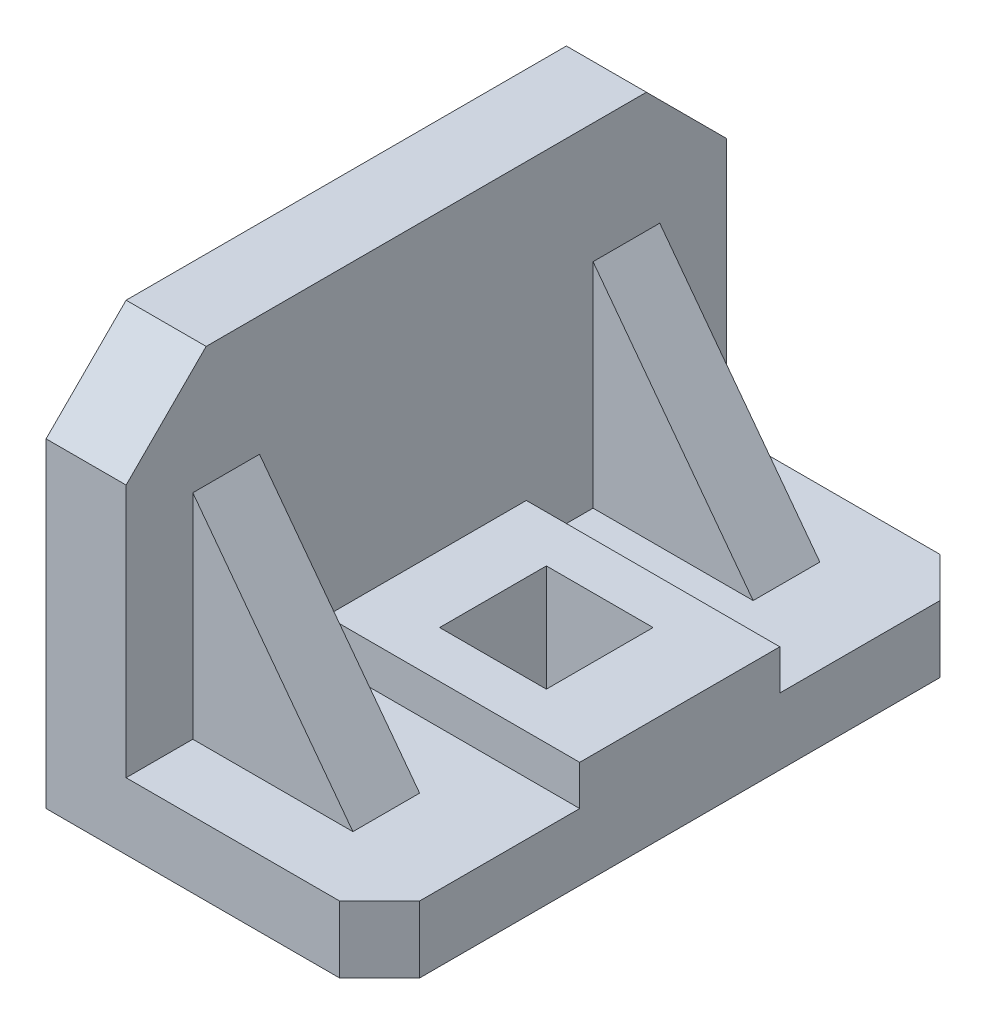
ISO-10303-21;
HEADER;
FILE_DESCRIPTION(('STEP AP214'),'2;1');
FILE_NAME('part.step','',(''),(''),'','','');
FILE_SCHEMA(('AUTOMOTIVE_DESIGN { 1 0 10303 214 1 1 1 1 }'));
ENDSEC;
DATA;
#1=APPLICATION_CONTEXT('core data for automotive mechanical design processes');
#2=APPLICATION_PROTOCOL_DEFINITION('international standard','automotive_design',2000,#1);
#3=PRODUCT_CONTEXT('',#1,'mechanical');
#4=PRODUCT('Part','Part','',(#3));
#5=PRODUCT_RELATED_PRODUCT_CATEGORY('part','',(#4));
#6=PRODUCT_DEFINITION_FORMATION('','',#4);
#7=PRODUCT_DEFINITION_CONTEXT('part definition',#1,'design');
#8=PRODUCT_DEFINITION('design','',#6,#7);
#9=PRODUCT_DEFINITION_SHAPE('','',#8);
#10=(LENGTH_UNIT() NAMED_UNIT(*) SI_UNIT(.MILLI.,.METRE.));
#11=(NAMED_UNIT(*) PLANE_ANGLE_UNIT() SI_UNIT($,.RADIAN.));
#12=(NAMED_UNIT(*) SI_UNIT($,.STERADIAN.) SOLID_ANGLE_UNIT());
#13=UNCERTAINTY_MEASURE_WITH_UNIT(LENGTH_MEASURE(1.E-05),#10,'distance_accuracy_value','');
#14=(GEOMETRIC_REPRESENTATION_CONTEXT(3) GLOBAL_UNCERTAINTY_ASSIGNED_CONTEXT((#13)) GLOBAL_UNIT_ASSIGNED_CONTEXT((#10,
#11,#12)) REPRESENTATION_CONTEXT('',''));
#15=CARTESIAN_POINT('',(0.,0.,0.));
#16=DIRECTION('',(0.,0.,1.));
#17=DIRECTION('',(1.,0.,0.));
#18=AXIS2_PLACEMENT_3D('',#15,#16,#17);
#19=CARTESIAN_POINT('',(304.8,1524.,2286.));
#20=DIRECTION('',(-1.,0.,0.));
#21=DIRECTION('',(0.,-1.,0.));
#22=AXIS2_PLACEMENT_3D('',#19,#20,#21);
#23=PLANE('',#22);
#24=DIRECTION('',(0.,-1.,0.));
#25=VECTOR('',#24,1.);
#26=CARTESIAN_POINT('',(304.8,1066.8,508.));
#27=LINE('',#26,#25);
#28=CARTESIAN_POINT('',(304.8,1066.8,508.));
#29=VERTEX_POINT('',#28);
#30=CARTESIAN_POINT('',(304.8,254.,508.));
#31=VERTEX_POINT('',#30);
#32=EDGE_CURVE('E219',#29,#31,#27,.T.);
#33=ORIENTED_EDGE('',*,*,#32,.F.);
#34=DIRECTION('',(0.,0.,1.));
#35=VECTOR('',#34,1.);
#36=CARTESIAN_POINT('',(304.8,1066.8,508.));
#37=LINE('',#36,#35);
#38=CARTESIAN_POINT('',(304.8,1066.8,254.));
#39=VERTEX_POINT('',#38);
#40=EDGE_CURVE('E205',#39,#29,#37,.T.);
#41=ORIENTED_EDGE('',*,*,#40,.F.);
#42=DIRECTION('',(0.,1.,0.));
#43=VECTOR('',#42,1.);
#44=CARTESIAN_POINT('',(304.8,1066.8,254.));
#45=LINE('',#44,#43);
#46=CARTESIAN_POINT('',(304.8,254.,254.));
#47=VERTEX_POINT('',#46);
#48=EDGE_CURVE('E214',#47,#39,#45,.T.);
#49=ORIENTED_EDGE('',*,*,#48,.F.);
#50=DIRECTION('',(0.,0.,-1.));
#51=VECTOR('',#50,1.);
#52=CARTESIAN_POINT('',(304.8,254.,762.));
#53=LINE('',#52,#51);
#54=CARTESIAN_POINT('',(304.8,254.,0.));
#55=VERTEX_POINT('',#54);
#56=EDGE_CURVE('E390',#47,#55,#53,.T.);
#57=ORIENTED_EDGE('',*,*,#56,.T.);
#58=DIRECTION('',(0.,1.,0.));
#59=VECTOR('',#58,1.);
#60=CARTESIAN_POINT('',(304.8,1524.,0.));
#61=LINE('',#60,#59);
#62=CARTESIAN_POINT('',(304.8,1219.2,0.));
#63=VERTEX_POINT('',#62);
#64=EDGE_CURVE('E413',#55,#63,#61,.T.);
#65=ORIENTED_EDGE('',*,*,#64,.T.);
#66=DIRECTION('',(0.,-0.707106781186547,-0.707106781186548));
#67=VECTOR('',#66,1.);
#68=CARTESIAN_POINT('',(304.8,1524.,304.8));
#69=LINE('',#68,#67);
#70=CARTESIAN_POINT('',(304.8,1524.,304.8));
#71=VERTEX_POINT('',#70);
#72=EDGE_CURVE('E338',#71,#63,#69,.T.);
#73=ORIENTED_EDGE('',*,*,#72,.F.);
#74=DIRECTION('',(0.,0.,-1.));
#75=VECTOR('',#74,1.);
#76=CARTESIAN_POINT('',(304.8,1524.,2286.));
#77=LINE('',#76,#75);
#78=CARTESIAN_POINT('',(304.8,1524.,1981.2));
#79=VERTEX_POINT('',#78);
#80=EDGE_CURVE('E434',#79,#71,#77,.T.);
#81=ORIENTED_EDGE('',*,*,#80,.F.);
#82=DIRECTION('',(0.,-0.707106781186548,0.707106781186548));
#83=VECTOR('',#82,1.);
#84=CARTESIAN_POINT('',(304.8,1524.,1981.2));
#85=LINE('',#84,#83);
#86=CARTESIAN_POINT('',(304.8,1219.2,2286.));
#87=VERTEX_POINT('',#86);
#88=EDGE_CURVE('E334',#79,#87,#85,.T.);
#89=ORIENTED_EDGE('',*,*,#88,.T.);
#90=DIRECTION('',(0.,1.,0.));
#91=VECTOR('',#90,1.);
#92=CARTESIAN_POINT('',(304.8,1524.,2286.));
#93=LINE('',#92,#91);
#94=CARTESIAN_POINT('',(304.8,254.,2286.));
#95=VERTEX_POINT('',#94);
#96=EDGE_CURVE('E417',#95,#87,#93,.T.);
#97=ORIENTED_EDGE('',*,*,#96,.F.);
#98=DIRECTION('',(0.,0.,-1.));
#99=VECTOR('',#98,1.);
#100=CARTESIAN_POINT('',(304.8,254.,2286.));
#101=LINE('',#100,#99);
#102=CARTESIAN_POINT('',(304.8,254.,2032.));
#103=VERTEX_POINT('',#102);
#104=EDGE_CURVE('E358',#95,#103,#101,.T.);
#105=ORIENTED_EDGE('',*,*,#104,.T.);
#106=DIRECTION('',(0.,-1.,0.));
#107=VECTOR('',#106,1.);
#108=CARTESIAN_POINT('',(304.8,1066.8,2032.));
#109=LINE('',#108,#107);
#110=CARTESIAN_POINT('',(304.8,1066.8,2032.));
#111=VERTEX_POINT('',#110);
#112=EDGE_CURVE('E230',#111,#103,#109,.T.);
#113=ORIENTED_EDGE('',*,*,#112,.F.);
#114=DIRECTION('',(0.,0.,1.));
#115=VECTOR('',#114,1.);
#116=CARTESIAN_POINT('',(304.8,1066.8,2032.));
#117=LINE('',#116,#115);
#118=CARTESIAN_POINT('',(304.8,1066.8,1778.));
#119=VERTEX_POINT('',#118);
#120=EDGE_CURVE('E244',#119,#111,#117,.T.);
#121=ORIENTED_EDGE('',*,*,#120,.F.);
#122=DIRECTION('',(0.,1.,0.));
#123=VECTOR('',#122,1.);
#124=CARTESIAN_POINT('',(304.8,1066.8,1778.));
#125=LINE('',#124,#123);
#126=CARTESIAN_POINT('',(304.8,254.,1778.));
#127=VERTEX_POINT('',#126);
#128=EDGE_CURVE('E234',#127,#119,#125,.T.);
#129=ORIENTED_EDGE('',*,*,#128,.F.);
#130=CARTESIAN_POINT('',(304.8,254.,1524.));
#131=VERTEX_POINT('',#130);
#132=EDGE_CURVE('E363',#127,#131,#101,.T.);
#133=ORIENTED_EDGE('',*,*,#132,.T.);
#134=DIRECTION('',(0.,1.,0.));
#135=VECTOR('',#134,1.);
#136=CARTESIAN_POINT('',(304.8,406.4,1524.));
#137=LINE('',#136,#135);
#138=CARTESIAN_POINT('',(304.8,406.4,1524.));
#139=VERTEX_POINT('',#138);
#140=EDGE_CURVE('E362',#131,#139,#137,.T.);
#141=ORIENTED_EDGE('',*,*,#140,.T.);
#142=DIRECTION('',(0.,0.,-1.));
#143=VECTOR('',#142,1.);
#144=CARTESIAN_POINT('',(304.8,406.4,2286.));
#145=LINE('',#144,#143);
#146=CARTESIAN_POINT('',(304.8,406.4,762.));
#147=VERTEX_POINT('',#146);
#148=EDGE_CURVE('E438',#139,#147,#145,.T.);
#149=ORIENTED_EDGE('',*,*,#148,.T.);
#150=DIRECTION('',(0.,-1.,0.));
#151=VECTOR('',#150,1.);
#152=CARTESIAN_POINT('',(304.8,406.4,762.));
#153=LINE('',#152,#151);
#154=CARTESIAN_POINT('',(304.8,254.,762.));
#155=VERTEX_POINT('',#154);
#156=EDGE_CURVE('E401',#147,#155,#153,.T.);
#157=ORIENTED_EDGE('',*,*,#156,.T.);
#158=EDGE_CURVE('E228',#155,#31,#53,.T.);
#159=ORIENTED_EDGE('',*,*,#158,.T.);
#160=EDGE_LOOP('',(#33,#41,#49,#57,#65,#73,#81,#89,#97,#105,#113,#121,#129,#133,#141,#149,#157,#159));
#161=FACE_BOUND('',#160,.T.);
#162=ADVANCED_FACE('F45',(#161),#23,.F.);
#163=CARTESIAN_POINT('',(304.8,254.,762.));
#164=DIRECTION('',(0.,-1.,0.));
#165=DIRECTION('',(0.,0.,-1.));
#166=AXIS2_PLACEMENT_3D('',#163,#164,#165);
#167=PLANE('',#166);
#168=DIRECTION('',(-1.,0.,0.));
#169=VECTOR('',#168,1.);
#170=CARTESIAN_POINT('',(914.4,254.,508.));
#171=LINE('',#170,#169);
#172=CARTESIAN_POINT('',(914.4,254.,508.));
#173=VERTEX_POINT('',#172);
#174=EDGE_CURVE('E221',#173,#31,#171,.T.);
#175=ORIENTED_EDGE('',*,*,#174,.T.);
#176=ORIENTED_EDGE('',*,*,#158,.F.);
#177=DIRECTION('',(1.,0.,0.));
#178=VECTOR('',#177,1.);
#179=CARTESIAN_POINT('',(304.8,254.,762.));
#180=LINE('',#179,#178);
#181=CARTESIAN_POINT('',(1270.,254.,762.));
#182=VERTEX_POINT('',#181);
#183=EDGE_CURVE('E387',#155,#182,#180,.T.);
#184=ORIENTED_EDGE('',*,*,#183,.T.);
#185=DIRECTION('',(0.,0.,-1.));
#186=VECTOR('',#185,1.);
#187=CARTESIAN_POINT('',(1270.,254.,762.));
#188=LINE('',#187,#186);
#189=CARTESIAN_POINT('',(1270.,254.,152.4));
#190=VERTEX_POINT('',#189);
#191=EDGE_CURVE('E397',#182,#190,#188,.T.);
#192=ORIENTED_EDGE('',*,*,#191,.T.);
#193=DIRECTION('',(0.707106781186548,0.,0.707106781186547));
#194=VECTOR('',#193,1.);
#195=CARTESIAN_POINT('',(1117.6,254.,0.));
#196=LINE('',#195,#194);
#197=CARTESIAN_POINT('',(1117.6,254.,0.));
#198=VERTEX_POINT('',#197);
#199=EDGE_CURVE('E302',#198,#190,#196,.T.);
#200=ORIENTED_EDGE('',*,*,#199,.F.);
#201=DIRECTION('',(1.,0.,0.));
#202=VECTOR('',#201,1.);
#203=CARTESIAN_POINT('',(304.8,254.,0.));
#204=LINE('',#203,#202);
#205=EDGE_CURVE('E391',#55,#198,#204,.T.);
#206=ORIENTED_EDGE('',*,*,#205,.F.);
#207=ORIENTED_EDGE('',*,*,#56,.F.);
#208=DIRECTION('',(-1.,0.,0.));
#209=VECTOR('',#208,1.);
#210=CARTESIAN_POINT('',(914.4,254.,254.));
#211=LINE('',#210,#209);
#212=CARTESIAN_POINT('',(914.4,254.,254.));
#213=VERTEX_POINT('',#212);
#214=EDGE_CURVE('E240',#213,#47,#211,.T.);
#215=ORIENTED_EDGE('',*,*,#214,.F.);
#216=DIRECTION('',(0.,0.,-1.));
#217=VECTOR('',#216,1.);
#218=CARTESIAN_POINT('',(914.4,254.,508.));
#219=LINE('',#218,#217);
#220=EDGE_CURVE('E215',#173,#213,#219,.T.);
#221=ORIENTED_EDGE('',*,*,#220,.F.);
#222=EDGE_LOOP('',(#175,#176,#184,#192,#200,#206,#207,#215,#221));
#223=FACE_BOUND('',#222,.T.);
#224=ADVANCED_FACE('F468',(#223),#167,.F.);
#225=CARTESIAN_POINT('',(304.8,254.,2286.));
#226=DIRECTION('',(0.,-1.,0.));
#227=DIRECTION('',(0.,0.,-1.));
#228=AXIS2_PLACEMENT_3D('',#225,#226,#227);
#229=PLANE('',#228);
#230=DIRECTION('',(-1.,0.,0.));
#231=VECTOR('',#230,1.);
#232=CARTESIAN_POINT('',(914.4,254.,2032.));
#233=LINE('',#232,#231);
#234=CARTESIAN_POINT('',(914.4,254.,2032.));
#235=VERTEX_POINT('',#234);
#236=EDGE_CURVE('E253',#235,#103,#233,.T.);
#237=ORIENTED_EDGE('',*,*,#236,.T.);
#238=ORIENTED_EDGE('',*,*,#104,.F.);
#239=DIRECTION('',(1.,0.,0.));
#240=VECTOR('',#239,1.);
#241=CARTESIAN_POINT('',(304.8,254.,2286.));
#242=LINE('',#241,#240);
#243=CARTESIAN_POINT('',(1117.6,254.,2286.));
#244=VERTEX_POINT('',#243);
#245=EDGE_CURVE('E367',#95,#244,#242,.T.);
#246=ORIENTED_EDGE('',*,*,#245,.T.);
#247=DIRECTION('',(-0.707106781186547,0.,0.707106781186547));
#248=VECTOR('',#247,1.);
#249=CARTESIAN_POINT('',(1270.,254.,2133.6));
#250=LINE('',#249,#248);
#251=CARTESIAN_POINT('',(1270.,254.,2133.6));
#252=VERTEX_POINT('',#251);
#253=EDGE_CURVE('E306',#252,#244,#250,.T.);
#254=ORIENTED_EDGE('',*,*,#253,.F.);
#255=DIRECTION('',(0.,0.,-1.));
#256=VECTOR('',#255,1.);
#257=CARTESIAN_POINT('',(1270.,254.,2286.));
#258=LINE('',#257,#256);
#259=CARTESIAN_POINT('',(1270.,254.,1524.));
#260=VERTEX_POINT('',#259);
#261=EDGE_CURVE('E368',#252,#260,#258,.T.);
#262=ORIENTED_EDGE('',*,*,#261,.T.);
#263=DIRECTION('',(1.,0.,0.));
#264=VECTOR('',#263,1.);
#265=CARTESIAN_POINT('',(304.8,254.,1524.));
#266=LINE('',#265,#264);
#267=EDGE_CURVE('E380',#131,#260,#266,.T.);
#268=ORIENTED_EDGE('',*,*,#267,.F.);
#269=ORIENTED_EDGE('',*,*,#132,.F.);
#270=DIRECTION('',(-1.,0.,0.));
#271=VECTOR('',#270,1.);
#272=CARTESIAN_POINT('',(914.4,254.,1778.));
#273=LINE('',#272,#271);
#274=CARTESIAN_POINT('',(914.4,254.,1778.));
#275=VERTEX_POINT('',#274);
#276=EDGE_CURVE('E243',#275,#127,#273,.T.);
#277=ORIENTED_EDGE('',*,*,#276,.F.);
#278=DIRECTION('',(0.,0.,-1.));
#279=VECTOR('',#278,1.);
#280=CARTESIAN_POINT('',(914.4,254.,2032.));
#281=LINE('',#280,#279);
#282=EDGE_CURVE('E241',#235,#275,#281,.T.);
#283=ORIENTED_EDGE('',*,*,#282,.F.);
#284=EDGE_LOOP('',(#237,#238,#246,#254,#262,#268,#269,#277,#283));
#285=FACE_BOUND('',#284,.T.);
#286=ADVANCED_FACE('F488',(#285),#229,.F.);
#287=CARTESIAN_POINT('',(0.,1524.,2286.));
#288=DIRECTION('',(1.,0.,0.));
#289=DIRECTION('',(0.,0.,-1.));
#290=AXIS2_PLACEMENT_3D('',#287,#288,#289);
#291=PLANE('',#290);
#292=DIRECTION('',(0.,-0.707106781186548,0.707106781186548));
#293=VECTOR('',#292,1.);
#294=CARTESIAN_POINT('',(0.,1524.,1981.2));
#295=LINE('',#294,#293);
#296=CARTESIAN_POINT('',(0.,1524.,1981.2));
#297=VERTEX_POINT('',#296);
#298=CARTESIAN_POINT('',(0.,1219.2,2286.));
#299=VERTEX_POINT('',#298);
#300=EDGE_CURVE('E330',#297,#299,#295,.T.);
#301=ORIENTED_EDGE('',*,*,#300,.F.);
#302=DIRECTION('',(0.,0.,-1.));
#303=VECTOR('',#302,1.);
#304=CARTESIAN_POINT('',(0.,1524.,2286.));
#305=LINE('',#304,#303);
#306=CARTESIAN_POINT('',(0.,1524.,304.8));
#307=VERTEX_POINT('',#306);
#308=EDGE_CURVE('E421',#297,#307,#305,.T.);
#309=ORIENTED_EDGE('',*,*,#308,.T.);
#310=DIRECTION('',(0.,-0.707106781186547,-0.707106781186548));
#311=VECTOR('',#310,1.);
#312=CARTESIAN_POINT('',(0.,1524.,304.8));
#313=LINE('',#312,#311);
#314=CARTESIAN_POINT('',(0.,1219.2,0.));
#315=VERTEX_POINT('',#314);
#316=EDGE_CURVE('E349',#307,#315,#313,.T.);
#317=ORIENTED_EDGE('',*,*,#316,.T.);
#318=DIRECTION('',(0.,-1.,0.));
#319=VECTOR('',#318,1.);
#320=CARTESIAN_POINT('',(0.,1524.,0.));
#321=LINE('',#320,#319);
#322=CARTESIAN_POINT('',(0.,0.,0.));
#323=VERTEX_POINT('',#322);
#324=EDGE_CURVE('E379',#315,#323,#321,.T.);
#325=ORIENTED_EDGE('',*,*,#324,.T.);
#326=DIRECTION('',(0.,0.,-1.));
#327=VECTOR('',#326,1.);
#328=CARTESIAN_POINT('',(0.,0.,2286.));
#329=LINE('',#328,#327);
#330=CARTESIAN_POINT('',(0.,0.,2286.));
#331=VERTEX_POINT('',#330);
#332=EDGE_CURVE('E11',#331,#323,#329,.T.);
#333=ORIENTED_EDGE('',*,*,#332,.F.);
#334=DIRECTION('',(0.,-1.,0.));
#335=VECTOR('',#334,1.);
#336=CARTESIAN_POINT('',(0.,1524.,2286.));
#337=LINE('',#336,#335);
#338=EDGE_CURVE('E409',#299,#331,#337,.T.);
#339=ORIENTED_EDGE('',*,*,#338,.F.);
#340=EDGE_LOOP('',(#301,#309,#317,#325,#333,#339));
#341=FACE_BOUND('',#340,.T.);
#342=ADVANCED_FACE('F47',(#341),#291,.F.);
#343=CARTESIAN_POINT('',(0.,1524.,2286.));
#344=DIRECTION('',(0.,-1.,0.));
#345=DIRECTION('',(0.,0.,-1.));
#346=AXIS2_PLACEMENT_3D('',#343,#344,#345);
#347=PLANE('',#346);
#348=DIRECTION('',(1.,0.,0.));
#349=VECTOR('',#348,1.);
#350=CARTESIAN_POINT('',(0.,1524.,1981.2));
#351=LINE('',#350,#349);
#352=EDGE_CURVE('E341',#297,#79,#351,.T.);
#353=ORIENTED_EDGE('',*,*,#352,.T.);
#354=ORIENTED_EDGE('',*,*,#80,.T.);
#355=DIRECTION('',(1.,0.,0.));
#356=VECTOR('',#355,1.);
#357=CARTESIAN_POINT('',(0.,1524.,304.8));
#358=LINE('',#357,#356);
#359=EDGE_CURVE('E346',#307,#71,#358,.T.);
#360=ORIENTED_EDGE('',*,*,#359,.F.);
#361=ORIENTED_EDGE('',*,*,#308,.F.);
#362=EDGE_LOOP('',(#353,#354,#360,#361));
#363=FACE_BOUND('',#362,.T.);
#364=ADVANCED_FACE('F541',(#363),#347,.F.);
#365=CARTESIAN_POINT('',(0.,0.,2286.));
#366=DIRECTION('',(0.,0.,1.));
#367=DIRECTION('',(1.,0.,0.));
#368=AXIS2_PLACEMENT_3D('',#365,#366,#367);
#369=PLANE('',#368);
#370=DIRECTION('',(0.,1.,0.));
#371=VECTOR('',#370,1.);
#372=CARTESIAN_POINT('',(1117.6,-50.8000000000001,2286.));
#373=LINE('',#372,#371);
#374=CARTESIAN_POINT('',(1117.6,0.,2286.));
#375=VERTEX_POINT('',#374);
#376=EDGE_CURVE('E292',#375,#244,#373,.T.);
#377=ORIENTED_EDGE('',*,*,#376,.T.);
#378=ORIENTED_EDGE('',*,*,#245,.F.);
#379=ORIENTED_EDGE('',*,*,#96,.T.);
#380=DIRECTION('',(1.,0.,0.));
#381=VECTOR('',#380,1.);
#382=CARTESIAN_POINT('',(0.,1219.2,2286.));
#383=LINE('',#382,#381);
#384=EDGE_CURVE('E333',#299,#87,#383,.T.);
#385=ORIENTED_EDGE('',*,*,#384,.F.);
#386=ORIENTED_EDGE('',*,*,#338,.T.);
#387=DIRECTION('',(1.,0.,0.));
#388=VECTOR('',#387,1.);
#389=CARTESIAN_POINT('',(0.,0.,2286.));
#390=LINE('',#389,#388);
#391=EDGE_CURVE('E412',#331,#375,#390,.T.);
#392=ORIENTED_EDGE('',*,*,#391,.T.);
#393=EDGE_LOOP('',(#377,#378,#379,#385,#386,#392));
#394=FACE_BOUND('',#393,.T.);
#395=ADVANCED_FACE('F495',(#394),#369,.T.);
#396=CARTESIAN_POINT('',(0.,0.,2286.));
#397=DIRECTION('',(0.,1.,0.));
#398=DIRECTION('',(0.,0.,1.));
#399=AXIS2_PLACEMENT_3D('',#396,#397,#398);
#400=PLANE('',#399);
#401=DIRECTION('',(-1.,0.,0.));
#402=VECTOR('',#401,1.);
#403=CARTESIAN_POINT('',(558.8,0.,939.8));
#404=LINE('',#403,#402);
#405=CARTESIAN_POINT('',(965.2,0.,939.8));
#406=VERTEX_POINT('',#405);
#407=CARTESIAN_POINT('',(558.8,0.,939.8));
#408=VERTEX_POINT('',#407);
#409=EDGE_CURVE('E271',#406,#408,#404,.T.);
#410=ORIENTED_EDGE('',*,*,#409,.T.);
#411=DIRECTION('',(0.,0.,1.));
#412=VECTOR('',#411,1.);
#413=CARTESIAN_POINT('',(558.8,0.,939.8));
#414=LINE('',#413,#412);
#415=CARTESIAN_POINT('',(558.8,0.,1346.2));
#416=VERTEX_POINT('',#415);
#417=EDGE_CURVE('E258',#408,#416,#414,.T.);
#418=ORIENTED_EDGE('',*,*,#417,.T.);
#419=DIRECTION('',(1.,0.,0.));
#420=VECTOR('',#419,1.);
#421=CARTESIAN_POINT('',(558.8,0.,1346.2));
#422=LINE('',#421,#420);
#423=CARTESIAN_POINT('',(965.2,0.,1346.2));
#424=VERTEX_POINT('',#423);
#425=EDGE_CURVE('E262',#416,#424,#422,.T.);
#426=ORIENTED_EDGE('',*,*,#425,.T.);
#427=DIRECTION('',(0.,0.,-1.));
#428=VECTOR('',#427,1.);
#429=CARTESIAN_POINT('',(965.2,0.,939.8));
#430=LINE('',#429,#428);
#431=EDGE_CURVE('E267',#424,#406,#430,.T.);
#432=ORIENTED_EDGE('',*,*,#431,.T.);
#433=EDGE_LOOP('',(#410,#418,#426,#432));
#434=FACE_BOUND('',#433,.T.);
#435=DIRECTION('',(1.,0.,0.));
#436=VECTOR('',#435,1.);
#437=CARTESIAN_POINT('',(0.,0.,0.));
#438=LINE('',#437,#436);
#439=CARTESIAN_POINT('',(1117.6,0.,0.));
#440=VERTEX_POINT('',#439);
#441=EDGE_CURVE('E424',#323,#440,#438,.T.);
#442=ORIENTED_EDGE('',*,*,#441,.T.);
#443=DIRECTION('',(0.707106781186548,0.,0.707106781186547));
#444=VECTOR('',#443,1.);
#445=CARTESIAN_POINT('',(1701.8,0.,584.199999999999));
#446=LINE('',#445,#444);
#447=CARTESIAN_POINT('',(1270.,0.,152.4));
#448=VERTEX_POINT('',#447);
#449=EDGE_CURVE('E325',#440,#448,#446,.T.);
#450=ORIENTED_EDGE('',*,*,#449,.T.);
#451=DIRECTION('',(0.,0.,-1.));
#452=VECTOR('',#451,1.);
#453=CARTESIAN_POINT('',(1270.,0.,2286.));
#454=LINE('',#453,#452);
#455=CARTESIAN_POINT('',(1270.,0.,2133.6));
#456=VERTEX_POINT('',#455);
#457=EDGE_CURVE('E54',#456,#448,#454,.T.);
#458=ORIENTED_EDGE('',*,*,#457,.F.);
#459=DIRECTION('',(-0.707106781186548,0.,0.707106781186548));
#460=VECTOR('',#459,1.);
#461=CARTESIAN_POINT('',(558.8,0.,2844.8));
#462=LINE('',#461,#460);
#463=EDGE_CURVE('E311',#456,#375,#462,.T.);
#464=ORIENTED_EDGE('',*,*,#463,.T.);
#465=ORIENTED_EDGE('',*,*,#391,.F.);
#466=ORIENTED_EDGE('',*,*,#332,.T.);
#467=EDGE_LOOP('',(#442,#450,#458,#464,#465,#466));
#468=FACE_BOUND('',#467,.T.);
#469=ADVANCED_FACE('F454',(#434,#468),#400,.F.);
#470=CARTESIAN_POINT('',(1270.,406.4,2286.));
#471=DIRECTION('',(-1.,0.,0.));
#472=DIRECTION('',(0.,0.,1.));
#473=AXIS2_PLACEMENT_3D('',#470,#471,#472);
#474=PLANE('',#473);
#475=ORIENTED_EDGE('',*,*,#457,.T.);
#476=DIRECTION('',(0.,1.,0.));
#477=VECTOR('',#476,1.);
#478=CARTESIAN_POINT('',(1270.,-50.8000000000001,152.4));
#479=LINE('',#478,#477);
#480=EDGE_CURVE('E307',#448,#190,#479,.T.);
#481=ORIENTED_EDGE('',*,*,#480,.T.);
#482=ORIENTED_EDGE('',*,*,#191,.F.);
#483=DIRECTION('',(0.,-1.,0.));
#484=VECTOR('',#483,1.);
#485=CARTESIAN_POINT('',(1270.,406.4,762.));
#486=LINE('',#485,#484);
#487=CARTESIAN_POINT('',(1270.,406.4,762.));
#488=VERTEX_POINT('',#487);
#489=EDGE_CURVE('E372',#488,#182,#486,.T.);
#490=ORIENTED_EDGE('',*,*,#489,.F.);
#491=DIRECTION('',(0.,0.,-1.));
#492=VECTOR('',#491,1.);
#493=CARTESIAN_POINT('',(1270.,406.4,2286.));
#494=LINE('',#493,#492);
#495=CARTESIAN_POINT('',(1270.,406.4,1524.));
#496=VERTEX_POINT('',#495);
#497=EDGE_CURVE('E442',#496,#488,#494,.T.);
#498=ORIENTED_EDGE('',*,*,#497,.F.);
#499=DIRECTION('',(0.,1.,0.));
#500=VECTOR('',#499,1.);
#501=CARTESIAN_POINT('',(1270.,406.4,1524.));
#502=LINE('',#501,#500);
#503=EDGE_CURVE('E371',#260,#496,#502,.T.);
#504=ORIENTED_EDGE('',*,*,#503,.F.);
#505=ORIENTED_EDGE('',*,*,#261,.F.);
#506=DIRECTION('',(0.,1.,0.));
#507=VECTOR('',#506,1.);
#508=CARTESIAN_POINT('',(1270.,-50.8000000000001,2133.6));
#509=LINE('',#508,#507);
#510=EDGE_CURVE('E314',#456,#252,#509,.T.);
#511=ORIENTED_EDGE('',*,*,#510,.F.);
#512=EDGE_LOOP('',(#475,#481,#482,#490,#498,#504,#505,#511));
#513=FACE_BOUND('',#512,.T.);
#514=ADVANCED_FACE('F450',(#513),#474,.F.);
#515=CARTESIAN_POINT('',(304.8,406.4,2286.));
#516=DIRECTION('',(0.,-1.,0.));
#517=DIRECTION('',(1.,0.,0.));
#518=AXIS2_PLACEMENT_3D('',#515,#516,#517);
#519=PLANE('',#518);
#520=DIRECTION('',(1.,0.,0.));
#521=VECTOR('',#520,1.);
#522=CARTESIAN_POINT('',(558.8,406.4,1346.2));
#523=LINE('',#522,#521);
#524=CARTESIAN_POINT('',(558.8,406.4,1346.2));
#525=VERTEX_POINT('',#524);
#526=CARTESIAN_POINT('',(965.2,406.4,1346.2));
#527=VERTEX_POINT('',#526);
#528=EDGE_CURVE('E278',#525,#527,#523,.T.);
#529=ORIENTED_EDGE('',*,*,#528,.F.);
#530=DIRECTION('',(0.,0.,1.));
#531=VECTOR('',#530,1.);
#532=CARTESIAN_POINT('',(558.8,406.4,939.8));
#533=LINE('',#532,#531);
#534=CARTESIAN_POINT('',(558.8,406.4,939.8));
#535=VERTEX_POINT('',#534);
#536=EDGE_CURVE('E257',#535,#525,#533,.T.);
#537=ORIENTED_EDGE('',*,*,#536,.F.);
#538=DIRECTION('',(-1.,0.,0.));
#539=VECTOR('',#538,1.);
#540=CARTESIAN_POINT('',(558.8,406.4,939.8));
#541=LINE('',#540,#539);
#542=CARTESIAN_POINT('',(965.2,406.4,939.8));
#543=VERTEX_POINT('',#542);
#544=EDGE_CURVE('E263',#543,#535,#541,.T.);
#545=ORIENTED_EDGE('',*,*,#544,.F.);
#546=DIRECTION('',(0.,0.,-1.));
#547=VECTOR('',#546,1.);
#548=CARTESIAN_POINT('',(965.2,406.4,939.8));
#549=LINE('',#548,#547);
#550=EDGE_CURVE('E282',#527,#543,#549,.T.);
#551=ORIENTED_EDGE('',*,*,#550,.F.);
#552=EDGE_LOOP('',(#529,#537,#545,#551));
#553=FACE_BOUND('',#552,.T.);
#554=ORIENTED_EDGE('',*,*,#148,.F.);
#555=DIRECTION('',(1.,0.,0.));
#556=VECTOR('',#555,1.);
#557=CARTESIAN_POINT('',(304.8,406.4,1524.));
#558=LINE('',#557,#556);
#559=EDGE_CURVE('E375',#139,#496,#558,.T.);
#560=ORIENTED_EDGE('',*,*,#559,.T.);
#561=ORIENTED_EDGE('',*,*,#497,.T.);
#562=DIRECTION('',(1.,0.,0.));
#563=VECTOR('',#562,1.);
#564=CARTESIAN_POINT('',(304.8,406.4,762.));
#565=LINE('',#564,#563);
#566=EDGE_CURVE('E345',#147,#488,#565,.T.);
#567=ORIENTED_EDGE('',*,*,#566,.F.);
#568=EDGE_LOOP('',(#554,#560,#561,#567));
#569=FACE_BOUND('',#568,.T.);
#570=ADVANCED_FACE('F477',(#553,#569),#519,.F.);
#571=CARTESIAN_POINT('',(0.,0.,0.));
#572=DIRECTION('',(0.,0.,1.));
#573=DIRECTION('',(1.,0.,0.));
#574=AXIS2_PLACEMENT_3D('',#571,#572,#573);
#575=PLANE('',#574);
#576=ORIENTED_EDGE('',*,*,#205,.T.);
#577=DIRECTION('',(0.,1.,0.));
#578=VECTOR('',#577,1.);
#579=CARTESIAN_POINT('',(1117.6,-50.8000000000001,0.));
#580=LINE('',#579,#578);
#581=EDGE_CURVE('E305',#440,#198,#580,.T.);
#582=ORIENTED_EDGE('',*,*,#581,.F.);
#583=ORIENTED_EDGE('',*,*,#441,.F.);
#584=ORIENTED_EDGE('',*,*,#324,.F.);
#585=DIRECTION('',(1.,0.,0.));
#586=VECTOR('',#585,1.);
#587=CARTESIAN_POINT('',(0.,1219.2,0.));
#588=LINE('',#587,#586);
#589=EDGE_CURVE('E329',#315,#63,#588,.T.);
#590=ORIENTED_EDGE('',*,*,#589,.T.);
#591=ORIENTED_EDGE('',*,*,#64,.F.);
#592=EDGE_LOOP('',(#576,#582,#583,#584,#590,#591));
#593=FACE_BOUND('',#592,.T.);
#594=ADVANCED_FACE('F462',(#593),#575,.F.);
#595=CARTESIAN_POINT('',(304.8,406.4,762.));
#596=DIRECTION('',(0.,0.,1.));
#597=DIRECTION('',(1.,0.,0.));
#598=AXIS2_PLACEMENT_3D('',#595,#596,#597);
#599=PLANE('',#598);
#600=ORIENTED_EDGE('',*,*,#489,.T.);
#601=ORIENTED_EDGE('',*,*,#183,.F.);
#602=ORIENTED_EDGE('',*,*,#156,.F.);
#603=ORIENTED_EDGE('',*,*,#566,.T.);
#604=EDGE_LOOP('',(#600,#601,#602,#603));
#605=FACE_BOUND('',#604,.T.);
#606=ADVANCED_FACE('F595',(#605),#599,.F.);
#607=CARTESIAN_POINT('',(304.8,406.4,1524.));
#608=DIRECTION('',(0.,0.,-1.));
#609=DIRECTION('',(-1.,0.,0.));
#610=AXIS2_PLACEMENT_3D('',#607,#608,#609);
#611=PLANE('',#610);
#612=ORIENTED_EDGE('',*,*,#503,.T.);
#613=ORIENTED_EDGE('',*,*,#559,.F.);
#614=ORIENTED_EDGE('',*,*,#140,.F.);
#615=ORIENTED_EDGE('',*,*,#267,.T.);
#616=EDGE_LOOP('',(#612,#613,#614,#615));
#617=FACE_BOUND('',#616,.T.);
#618=ADVANCED_FACE('F480',(#617),#611,.F.);
#619=CARTESIAN_POINT('',(0.,1524.,304.8));
#620=DIRECTION('',(0.,-0.707106781186548,0.707106781186547));
#621=DIRECTION('',(0.,-0.707106781186547,-0.707106781186548));
#622=AXIS2_PLACEMENT_3D('',#619,#620,#621);
#623=PLANE('',#622);
#624=ORIENTED_EDGE('',*,*,#72,.T.);
#625=ORIENTED_EDGE('',*,*,#589,.F.);
#626=ORIENTED_EDGE('',*,*,#316,.F.);
#627=ORIENTED_EDGE('',*,*,#359,.T.);
#628=EDGE_LOOP('',(#624,#625,#626,#627));
#629=FACE_BOUND('',#628,.T.);
#630=ADVANCED_FACE('F589',(#629),#623,.F.);
#631=CARTESIAN_POINT('',(0.,1524.,1981.2));
#632=DIRECTION('',(0.,0.707106781186548,0.707106781186548));
#633=DIRECTION('',(0.,-0.707106781186548,0.707106781186548));
#634=AXIS2_PLACEMENT_3D('',#631,#632,#633);
#635=PLANE('',#634);
#636=ORIENTED_EDGE('',*,*,#88,.F.);
#637=ORIENTED_EDGE('',*,*,#352,.F.);
#638=ORIENTED_EDGE('',*,*,#300,.T.);
#639=ORIENTED_EDGE('',*,*,#384,.T.);
#640=EDGE_LOOP('',(#636,#637,#638,#639));
#641=FACE_BOUND('',#640,.T.);
#642=ADVANCED_FACE('F586',(#641),#635,.T.);
#643=CARTESIAN_POINT('',(1270.,-50.8000000000001,2133.6));
#644=DIRECTION('',(-0.707106781186547,0.,-0.707106781186547));
#645=DIRECTION('',(-0.707106781186548,0.,0.707106781186548));
#646=AXIS2_PLACEMENT_3D('',#643,#644,#645);
#647=PLANE('',#646);
#648=ORIENTED_EDGE('',*,*,#510,.T.);
#649=ORIENTED_EDGE('',*,*,#253,.T.);
#650=ORIENTED_EDGE('',*,*,#376,.F.);
#651=ORIENTED_EDGE('',*,*,#463,.F.);
#652=EDGE_LOOP('',(#648,#649,#650,#651));
#653=FACE_BOUND('',#652,.T.);
#654=ADVANCED_FACE('F493',(#653),#647,.F.);
#655=CARTESIAN_POINT('',(1117.6,-50.8000000000001,0.));
#656=DIRECTION('',(-0.707106781186547,0.,0.707106781186548));
#657=DIRECTION('',(0.707106781186548,0.,0.707106781186547));
#658=AXIS2_PLACEMENT_3D('',#655,#656,#657);
#659=PLANE('',#658);
#660=ORIENTED_EDGE('',*,*,#581,.T.);
#661=ORIENTED_EDGE('',*,*,#199,.T.);
#662=ORIENTED_EDGE('',*,*,#480,.F.);
#663=ORIENTED_EDGE('',*,*,#449,.F.);
#664=EDGE_LOOP('',(#660,#661,#662,#663));
#665=FACE_BOUND('',#664,.T.);
#666=ADVANCED_FACE('F459',(#665),#659,.F.);
#667=CARTESIAN_POINT('',(558.8,0.,939.8));
#668=DIRECTION('',(-1.,0.,0.));
#669=DIRECTION('',(0.,-1.,0.));
#670=AXIS2_PLACEMENT_3D('',#667,#668,#669);
#671=PLANE('',#670);
#672=ORIENTED_EDGE('',*,*,#536,.T.);
#673=DIRECTION('',(0.,1.,0.));
#674=VECTOR('',#673,1.);
#675=CARTESIAN_POINT('',(558.8,0.,1346.2));
#676=LINE('',#675,#674);
#677=EDGE_CURVE('E275',#416,#525,#676,.T.);
#678=ORIENTED_EDGE('',*,*,#677,.F.);
#679=ORIENTED_EDGE('',*,*,#417,.F.);
#680=DIRECTION('',(0.,1.,0.));
#681=VECTOR('',#680,1.);
#682=CARTESIAN_POINT('',(558.8,0.,939.8));
#683=LINE('',#682,#681);
#684=EDGE_CURVE('E289',#408,#535,#683,.T.);
#685=ORIENTED_EDGE('',*,*,#684,.T.);
#686=EDGE_LOOP('',(#672,#678,#679,#685));
#687=FACE_BOUND('',#686,.T.);
#688=ADVANCED_FACE('F561',(#687),#671,.F.);
#689=CARTESIAN_POINT('',(558.8,0.,939.8));
#690=DIRECTION('',(0.,0.,-1.));
#691=DIRECTION('',(-1.,0.,0.));
#692=AXIS2_PLACEMENT_3D('',#689,#690,#691);
#693=PLANE('',#692);
#694=ORIENTED_EDGE('',*,*,#544,.T.);
#695=ORIENTED_EDGE('',*,*,#684,.F.);
#696=ORIENTED_EDGE('',*,*,#409,.F.);
#697=DIRECTION('',(0.,1.,0.));
#698=VECTOR('',#697,1.);
#699=CARTESIAN_POINT('',(965.2,0.,939.8));
#700=LINE('',#699,#698);
#701=EDGE_CURVE('E293',#406,#543,#700,.T.);
#702=ORIENTED_EDGE('',*,*,#701,.T.);
#703=EDGE_LOOP('',(#694,#695,#696,#702));
#704=FACE_BOUND('',#703,.T.);
#705=ADVANCED_FACE('F557',(#704),#693,.F.);
#706=CARTESIAN_POINT('',(965.2,0.,939.8));
#707=DIRECTION('',(1.,0.,0.));
#708=DIRECTION('',(0.,1.,0.));
#709=AXIS2_PLACEMENT_3D('',#706,#707,#708);
#710=PLANE('',#709);
#711=ORIENTED_EDGE('',*,*,#550,.T.);
#712=ORIENTED_EDGE('',*,*,#701,.F.);
#713=ORIENTED_EDGE('',*,*,#431,.F.);
#714=DIRECTION('',(0.,1.,0.));
#715=VECTOR('',#714,1.);
#716=CARTESIAN_POINT('',(965.2,0.,1346.2));
#717=LINE('',#716,#715);
#718=EDGE_CURVE('E296',#424,#527,#717,.T.);
#719=ORIENTED_EDGE('',*,*,#718,.T.);
#720=EDGE_LOOP('',(#711,#712,#713,#719));
#721=FACE_BOUND('',#720,.T.);
#722=ADVANCED_FACE('F569',(#721),#710,.F.);
#723=CARTESIAN_POINT('',(558.8,0.,1346.2));
#724=DIRECTION('',(0.,0.,1.));
#725=DIRECTION('',(1.,0.,0.));
#726=AXIS2_PLACEMENT_3D('',#723,#724,#725);
#727=PLANE('',#726);
#728=ORIENTED_EDGE('',*,*,#528,.T.);
#729=ORIENTED_EDGE('',*,*,#718,.F.);
#730=ORIENTED_EDGE('',*,*,#425,.F.);
#731=ORIENTED_EDGE('',*,*,#677,.T.);
#732=EDGE_LOOP('',(#728,#729,#730,#731));
#733=FACE_BOUND('',#732,.T.);
#734=ADVANCED_FACE('F566',(#733),#727,.F.);
#735=CARTESIAN_POINT('',(914.4,1066.8,2032.));
#736=DIRECTION('',(0.,0.,-1.));
#737=DIRECTION('',(-1.,0.,0.));
#738=AXIS2_PLACEMENT_3D('',#735,#736,#737);
#739=PLANE('',#738);
#740=ORIENTED_EDGE('',*,*,#236,.F.);
#741=DIRECTION('',(0.6,-0.8,0.));
#742=VECTOR('',#741,1.);
#743=CARTESIAN_POINT('',(304.8,1066.8,2032.));
#744=LINE('',#743,#742);
#745=EDGE_CURVE('E69',#111,#235,#744,.T.);
#746=ORIENTED_EDGE('',*,*,#745,.F.);
#747=ORIENTED_EDGE('',*,*,#112,.T.);
#748=EDGE_LOOP('',(#740,#746,#747));
#749=FACE_BOUND('',#748,.T.);
#750=ADVANCED_FACE('F576',(#749),#739,.F.);
#751=CARTESIAN_POINT('',(914.4,1066.8,1778.));
#752=DIRECTION('',(0.,0.,1.));
#753=DIRECTION('',(1.,0.,0.));
#754=AXIS2_PLACEMENT_3D('',#751,#752,#753);
#755=PLANE('',#754);
#756=ORIENTED_EDGE('',*,*,#128,.T.);
#757=DIRECTION('',(0.6,-0.8,0.));
#758=VECTOR('',#757,1.);
#759=CARTESIAN_POINT('',(304.8,1066.8,1778.));
#760=LINE('',#759,#758);
#761=EDGE_CURVE('E510',#119,#275,#760,.T.);
#762=ORIENTED_EDGE('',*,*,#761,.T.);
#763=ORIENTED_EDGE('',*,*,#276,.T.);
#764=EDGE_LOOP('',(#756,#762,#763));
#765=FACE_BOUND('',#764,.T.);
#766=ADVANCED_FACE('F520',(#765),#755,.F.);
#767=CARTESIAN_POINT('',(914.4,1066.8,508.));
#768=DIRECTION('',(0.,0.,-1.));
#769=DIRECTION('',(0.,1.,0.));
#770=AXIS2_PLACEMENT_3D('',#767,#768,#769);
#771=PLANE('',#770);
#772=ORIENTED_EDGE('',*,*,#174,.F.);
#773=DIRECTION('',(-0.6,0.8,0.));
#774=VECTOR('',#773,1.);
#775=CARTESIAN_POINT('',(304.8,1066.8,508.));
#776=LINE('',#775,#774);
#777=EDGE_CURVE('E61',#173,#29,#776,.T.);
#778=ORIENTED_EDGE('',*,*,#777,.T.);
#779=ORIENTED_EDGE('',*,*,#32,.T.);
#780=EDGE_LOOP('',(#772,#778,#779));
#781=FACE_BOUND('',#780,.T.);
#782=ADVANCED_FACE('F218',(#781),#771,.F.);
#783=CARTESIAN_POINT('',(914.4,1066.8,254.));
#784=DIRECTION('',(0.,0.,1.));
#785=DIRECTION('',(0.,-1.,0.));
#786=AXIS2_PLACEMENT_3D('',#783,#784,#785);
#787=PLANE('',#786);
#788=ORIENTED_EDGE('',*,*,#48,.T.);
#789=DIRECTION('',(-0.6,0.8,0.));
#790=VECTOR('',#789,1.);
#791=CARTESIAN_POINT('',(304.8,1066.8,254.));
#792=LINE('',#791,#790);
#793=EDGE_CURVE('E208',#213,#39,#792,.T.);
#794=ORIENTED_EDGE('',*,*,#793,.F.);
#795=ORIENTED_EDGE('',*,*,#214,.T.);
#796=EDGE_LOOP('',(#788,#794,#795));
#797=FACE_BOUND('',#796,.T.);
#798=ADVANCED_FACE('F506',(#797),#787,.F.);
#799=CARTESIAN_POINT('',(304.8,1066.8,1778.));
#800=DIRECTION('',(-0.8,-0.600000000000001,0.));
#801=DIRECTION('',(0.6,-0.8,0.));
#802=AXIS2_PLACEMENT_3D('',#799,#800,#801);
#803=PLANE('',#802);
#804=ORIENTED_EDGE('',*,*,#745,.T.);
#805=ORIENTED_EDGE('',*,*,#282,.T.);
#806=ORIENTED_EDGE('',*,*,#761,.F.);
#807=ORIENTED_EDGE('',*,*,#120,.T.);
#808=EDGE_LOOP('',(#804,#805,#806,#807));
#809=FACE_BOUND('',#808,.T.);
#810=ADVANCED_FACE('F522',(#809),#803,.F.);
#811=CARTESIAN_POINT('',(304.8,1066.8,508.));
#812=DIRECTION('',(-0.8,-0.6,0.));
#813=DIRECTION('',(0.6,-0.8,0.));
#814=AXIS2_PLACEMENT_3D('',#811,#812,#813);
#815=PLANE('',#814);
#816=ORIENTED_EDGE('',*,*,#793,.T.);
#817=ORIENTED_EDGE('',*,*,#40,.T.);
#818=ORIENTED_EDGE('',*,*,#777,.F.);
#819=ORIENTED_EDGE('',*,*,#220,.T.);
#820=EDGE_LOOP('',(#816,#817,#818,#819));
#821=FACE_BOUND('',#820,.T.);
#822=ADVANCED_FACE('F206',(#821),#815,.F.);
#823=CLOSED_SHELL('',(#162,#224,#286,#342,#364,#395,#469,#514,#570,#594,#606,#618,#630,#642,
#654,#666,#688,#705,#722,#734,#750,#766,#782,#798,#810,#822));
#824=MANIFOLD_SOLID_BREP('B2',#823);
#825=ADVANCED_BREP_SHAPE_REPRESENTATION('',(#18,#824),#14);
#826=SHAPE_DEFINITION_REPRESENTATION(#9,#825);
ENDSEC;
END-ISO-10303-21;
